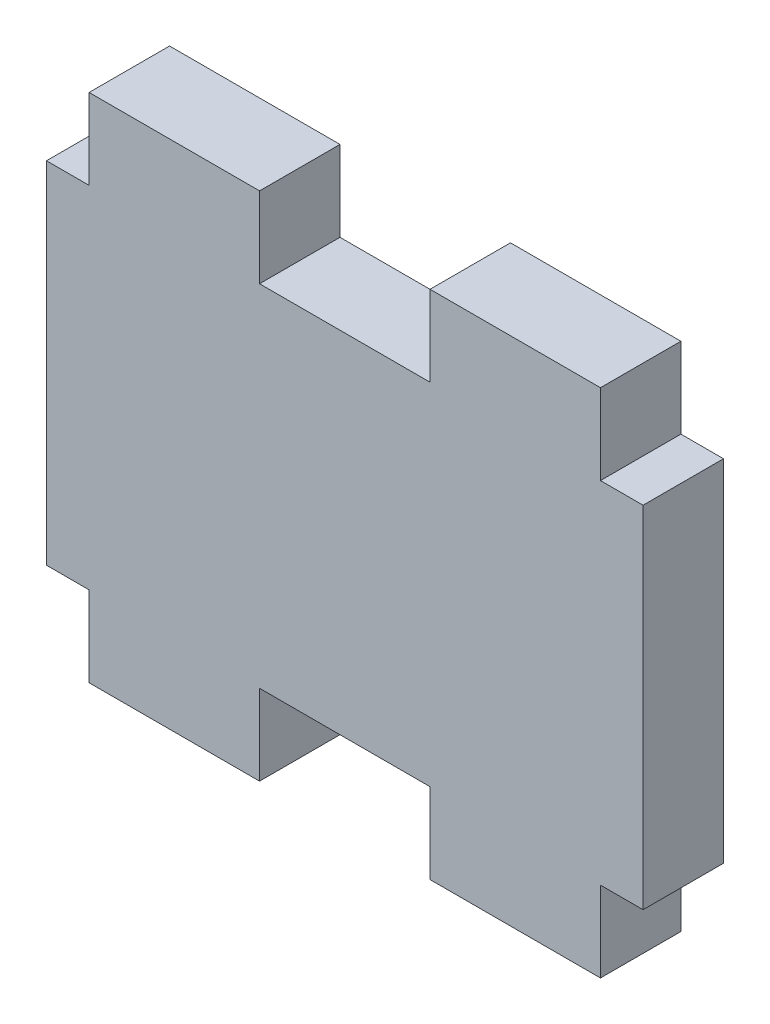
ISO-10303-21;
HEADER;
FILE_DESCRIPTION(('STEP AP214'),'2;1');
FILE_NAME('part.step','',(''),(''),'','','');
FILE_SCHEMA(('AUTOMOTIVE_DESIGN { 1 0 10303 214 1 1 1 1 }'));
ENDSEC;
DATA;
#1=APPLICATION_CONTEXT('core data for automotive mechanical design processes');
#2=APPLICATION_PROTOCOL_DEFINITION('international standard','automotive_design',2000,#1);
#3=PRODUCT_CONTEXT('',#1,'mechanical');
#4=PRODUCT('Part','Part','',(#3));
#5=PRODUCT_RELATED_PRODUCT_CATEGORY('part','',(#4));
#6=PRODUCT_DEFINITION_FORMATION('','',#4);
#7=PRODUCT_DEFINITION_CONTEXT('part definition',#1,'design');
#8=PRODUCT_DEFINITION('design','',#6,#7);
#9=PRODUCT_DEFINITION_SHAPE('','',#8);
#10=(LENGTH_UNIT() NAMED_UNIT(*) SI_UNIT(.MILLI.,.METRE.));
#11=(NAMED_UNIT(*) PLANE_ANGLE_UNIT() SI_UNIT($,.RADIAN.));
#12=(NAMED_UNIT(*) SI_UNIT($,.STERADIAN.) SOLID_ANGLE_UNIT());
#13=UNCERTAINTY_MEASURE_WITH_UNIT(LENGTH_MEASURE(1.E-05),#10,'distance_accuracy_value','');
#14=(GEOMETRIC_REPRESENTATION_CONTEXT(3) GLOBAL_UNCERTAINTY_ASSIGNED_CONTEXT((#13)) GLOBAL_UNIT_ASSIGNED_CONTEXT((#10,
#11,#12)) REPRESENTATION_CONTEXT('',''));
#15=CARTESIAN_POINT('',(0.,0.,0.));
#16=DIRECTION('',(0.,0.,1.));
#17=DIRECTION('',(1.,0.,0.));
#18=AXIS2_PLACEMENT_3D('',#15,#16,#17);
#19=CARTESIAN_POINT('',(0.,0.,2.9972));
#20=DIRECTION('',(1.,0.,0.));
#21=DIRECTION('',(0.,0.,-1.));
#22=AXIS2_PLACEMENT_3D('',#19,#20,#21);
#23=PLANE('',#22);
#24=DIRECTION('',(0.,-1.,0.));
#25=VECTOR('',#24,1.);
#26=CARTESIAN_POINT('',(0.,0.,0.));
#27=LINE('',#26,#25);
#28=CARTESIAN_POINT('',(0.,13.05052,0.));
#29=VERTEX_POINT('',#28);
#30=CARTESIAN_POINT('',(0.,0.,0.));
#31=VERTEX_POINT('',#30);
#32=EDGE_CURVE('E203',#29,#31,#27,.T.);
#33=ORIENTED_EDGE('',*,*,#32,.T.);
#34=DIRECTION('',(0.,0.,-1.));
#35=VECTOR('',#34,1.);
#36=CARTESIAN_POINT('',(0.,0.,2.9972));
#37=LINE('',#36,#35);
#38=CARTESIAN_POINT('',(0.,0.,2.9972));
#39=VERTEX_POINT('',#38);
#40=EDGE_CURVE('E11',#39,#31,#37,.T.);
#41=ORIENTED_EDGE('',*,*,#40,.F.);
#42=DIRECTION('',(0.,-1.,0.));
#43=VECTOR('',#42,1.);
#44=CARTESIAN_POINT('',(0.,0.,2.9972));
#45=LINE('',#44,#43);
#46=CARTESIAN_POINT('',(0.,13.05052,2.9972));
#47=VERTEX_POINT('',#46);
#48=EDGE_CURVE('E241',#47,#39,#45,.T.);
#49=ORIENTED_EDGE('',*,*,#48,.F.);
#50=DIRECTION('',(0.,0.,-1.));
#51=VECTOR('',#50,1.);
#52=CARTESIAN_POINT('',(0.,13.05052,2.9972));
#53=LINE('',#52,#51);
#54=EDGE_CURVE('E199',#47,#29,#53,.T.);
#55=ORIENTED_EDGE('',*,*,#54,.T.);
#56=EDGE_LOOP('',(#33,#41,#49,#55));
#57=FACE_BOUND('',#56,.T.);
#58=ADVANCED_FACE('F35',(#57),#23,.F.);
#59=CARTESIAN_POINT('',(0.,0.,2.9972));
#60=DIRECTION('',(0.,1.,0.));
#61=DIRECTION('',(0.,0.,1.));
#62=AXIS2_PLACEMENT_3D('',#59,#60,#61);
#63=PLANE('',#62);
#64=DIRECTION('',(1.,0.,0.));
#65=VECTOR('',#64,1.);
#66=CARTESIAN_POINT('',(0.,0.,0.));
#67=LINE('',#66,#65);
#68=CARTESIAN_POINT('',(1.5875,0.,0.));
#69=VERTEX_POINT('',#68);
#70=EDGE_CURVE('E206',#31,#69,#67,.T.);
#71=ORIENTED_EDGE('',*,*,#70,.T.);
#72=DIRECTION('',(0.,0.,-1.));
#73=VECTOR('',#72,1.);
#74=CARTESIAN_POINT('',(1.5875,0.,2.9972));
#75=LINE('',#74,#73);
#76=CARTESIAN_POINT('',(1.5875,0.,2.9972));
#77=VERTEX_POINT('',#76);
#78=EDGE_CURVE('E43',#77,#69,#75,.T.);
#79=ORIENTED_EDGE('',*,*,#78,.F.);
#80=DIRECTION('',(1.,0.,0.));
#81=VECTOR('',#80,1.);
#82=CARTESIAN_POINT('',(0.,0.,2.9972));
#83=LINE('',#82,#81);
#84=EDGE_CURVE('E130',#39,#77,#83,.T.);
#85=ORIENTED_EDGE('',*,*,#84,.F.);
#86=ORIENTED_EDGE('',*,*,#40,.T.);
#87=EDGE_LOOP('',(#71,#79,#85,#86));
#88=FACE_BOUND('',#87,.T.);
#89=ADVANCED_FACE('F359',(#88),#63,.F.);
#90=CARTESIAN_POINT('',(1.5875,0.,2.9972));
#91=DIRECTION('',(1.,0.,0.));
#92=DIRECTION('',(0.,1.,0.));
#93=AXIS2_PLACEMENT_3D('',#90,#91,#92);
#94=PLANE('',#93);
#95=DIRECTION('',(0.,-1.,0.));
#96=VECTOR('',#95,1.);
#97=CARTESIAN_POINT('',(1.5875,0.,0.));
#98=LINE('',#97,#96);
#99=CARTESIAN_POINT('',(1.5875,-2.9972,0.));
#100=VERTEX_POINT('',#99);
#101=EDGE_CURVE('E208',#69,#100,#98,.T.);
#102=ORIENTED_EDGE('',*,*,#101,.T.);
#103=DIRECTION('',(0.,0.,-1.));
#104=VECTOR('',#103,1.);
#105=CARTESIAN_POINT('',(1.5875,-2.9972,2.9972));
#106=LINE('',#105,#104);
#107=CARTESIAN_POINT('',(1.5875,-2.9972,2.9972));
#108=VERTEX_POINT('',#107);
#109=EDGE_CURVE('E284',#108,#100,#106,.T.);
#110=ORIENTED_EDGE('',*,*,#109,.F.);
#111=DIRECTION('',(0.,-1.,0.));
#112=VECTOR('',#111,1.);
#113=CARTESIAN_POINT('',(1.5875,0.,2.9972));
#114=LINE('',#113,#112);
#115=EDGE_CURVE('E292',#77,#108,#114,.T.);
#116=ORIENTED_EDGE('',*,*,#115,.F.);
#117=ORIENTED_EDGE('',*,*,#78,.T.);
#118=EDGE_LOOP('',(#102,#110,#116,#117));
#119=FACE_BOUND('',#118,.T.);
#120=ADVANCED_FACE('F290',(#119),#94,.F.);
#121=CARTESIAN_POINT('',(1.5875,-2.9972,2.9972));
#122=DIRECTION('',(0.,1.,0.));
#123=DIRECTION('',(-1.,0.,0.));
#124=AXIS2_PLACEMENT_3D('',#121,#122,#123);
#125=PLANE('',#124);
#126=DIRECTION('',(1.,0.,0.));
#127=VECTOR('',#126,1.);
#128=CARTESIAN_POINT('',(1.5875,-2.9972,0.));
#129=LINE('',#128,#127);
#130=CARTESIAN_POINT('',(7.9375,-2.9972,0.));
#131=VERTEX_POINT('',#130);
#132=EDGE_CURVE('E210',#100,#131,#129,.T.);
#133=ORIENTED_EDGE('',*,*,#132,.T.);
#134=DIRECTION('',(0.,0.,-1.));
#135=VECTOR('',#134,1.);
#136=CARTESIAN_POINT('',(7.9375,-2.9972,2.9972));
#137=LINE('',#136,#135);
#138=CARTESIAN_POINT('',(7.9375,-2.9972,2.9972));
#139=VERTEX_POINT('',#138);
#140=EDGE_CURVE('E281',#139,#131,#137,.T.);
#141=ORIENTED_EDGE('',*,*,#140,.F.);
#142=DIRECTION('',(1.,0.,0.));
#143=VECTOR('',#142,1.);
#144=CARTESIAN_POINT('',(1.5875,-2.9972,2.9972));
#145=LINE('',#144,#143);
#146=EDGE_CURVE('E310',#108,#139,#145,.T.);
#147=ORIENTED_EDGE('',*,*,#146,.F.);
#148=ORIENTED_EDGE('',*,*,#109,.T.);
#149=EDGE_LOOP('',(#133,#141,#147,#148));
#150=FACE_BOUND('',#149,.T.);
#151=ADVANCED_FACE('F301',(#150),#125,.F.);
#152=CARTESIAN_POINT('',(7.9375,-2.9972,2.9972));
#153=DIRECTION('',(-1.,0.,0.));
#154=DIRECTION('',(0.,0.,1.));
#155=AXIS2_PLACEMENT_3D('',#152,#153,#154);
#156=PLANE('',#155);
#157=DIRECTION('',(0.,1.,0.));
#158=VECTOR('',#157,1.);
#159=CARTESIAN_POINT('',(7.9375,-2.9972,0.));
#160=LINE('',#159,#158);
#161=CARTESIAN_POINT('',(7.9375,0.,0.));
#162=VERTEX_POINT('',#161);
#163=EDGE_CURVE('E212',#131,#162,#160,.T.);
#164=ORIENTED_EDGE('',*,*,#163,.T.);
#165=DIRECTION('',(0.,0.,-1.));
#166=VECTOR('',#165,1.);
#167=CARTESIAN_POINT('',(7.9375,0.,2.9972));
#168=LINE('',#167,#166);
#169=CARTESIAN_POINT('',(7.9375,0.,2.9972));
#170=VERTEX_POINT('',#169);
#171=EDGE_CURVE('E278',#170,#162,#168,.T.);
#172=ORIENTED_EDGE('',*,*,#171,.F.);
#173=DIRECTION('',(0.,1.,0.));
#174=VECTOR('',#173,1.);
#175=CARTESIAN_POINT('',(7.9375,-2.9972,2.9972));
#176=LINE('',#175,#174);
#177=EDGE_CURVE('E307',#139,#170,#176,.T.);
#178=ORIENTED_EDGE('',*,*,#177,.F.);
#179=ORIENTED_EDGE('',*,*,#140,.T.);
#180=EDGE_LOOP('',(#164,#172,#178,#179));
#181=FACE_BOUND('',#180,.T.);
#182=ADVANCED_FACE('F305',(#181),#156,.F.);
#183=CARTESIAN_POINT('',(7.9375,0.,2.9972));
#184=DIRECTION('',(0.,1.,0.));
#185=DIRECTION('',(0.,0.,1.));
#186=AXIS2_PLACEMENT_3D('',#183,#184,#185);
#187=PLANE('',#186);
#188=DIRECTION('',(1.,0.,0.));
#189=VECTOR('',#188,1.);
#190=CARTESIAN_POINT('',(7.9375,0.,0.));
#191=LINE('',#190,#189);
#192=CARTESIAN_POINT('',(14.2875,0.,0.));
#193=VERTEX_POINT('',#192);
#194=EDGE_CURVE('E214',#162,#193,#191,.T.);
#195=ORIENTED_EDGE('',*,*,#194,.T.);
#196=DIRECTION('',(0.,0.,-1.));
#197=VECTOR('',#196,1.);
#198=CARTESIAN_POINT('',(14.2875,0.,2.9972));
#199=LINE('',#198,#197);
#200=CARTESIAN_POINT('',(14.2875,0.,2.9972));
#201=VERTEX_POINT('',#200);
#202=EDGE_CURVE('E275',#201,#193,#199,.T.);
#203=ORIENTED_EDGE('',*,*,#202,.F.);
#204=DIRECTION('',(1.,0.,0.));
#205=VECTOR('',#204,1.);
#206=CARTESIAN_POINT('',(7.9375,0.,2.9972));
#207=LINE('',#206,#205);
#208=EDGE_CURVE('E309',#170,#201,#207,.T.);
#209=ORIENTED_EDGE('',*,*,#208,.F.);
#210=ORIENTED_EDGE('',*,*,#171,.T.);
#211=EDGE_LOOP('',(#195,#203,#209,#210));
#212=FACE_BOUND('',#211,.T.);
#213=ADVANCED_FACE('F372',(#212),#187,.F.);
#214=CARTESIAN_POINT('',(14.2875,0.,2.9972));
#215=DIRECTION('',(1.,0.,0.));
#216=DIRECTION('',(0.,0.,-1.));
#217=AXIS2_PLACEMENT_3D('',#214,#215,#216);
#218=PLANE('',#217);
#219=DIRECTION('',(0.,-1.,0.));
#220=VECTOR('',#219,1.);
#221=CARTESIAN_POINT('',(14.2875,0.,0.));
#222=LINE('',#221,#220);
#223=CARTESIAN_POINT('',(14.2875,-2.9972,0.));
#224=VERTEX_POINT('',#223);
#225=EDGE_CURVE('E216',#193,#224,#222,.T.);
#226=ORIENTED_EDGE('',*,*,#225,.T.);
#227=DIRECTION('',(0.,0.,-1.));
#228=VECTOR('',#227,1.);
#229=CARTESIAN_POINT('',(14.2875,-2.9972,2.9972));
#230=LINE('',#229,#228);
#231=CARTESIAN_POINT('',(14.2875,-2.9972,2.9972));
#232=VERTEX_POINT('',#231);
#233=EDGE_CURVE('E272',#232,#224,#230,.T.);
#234=ORIENTED_EDGE('',*,*,#233,.F.);
#235=DIRECTION('',(0.,-1.,0.));
#236=VECTOR('',#235,1.);
#237=CARTESIAN_POINT('',(14.2875,0.,2.9972));
#238=LINE('',#237,#236);
#239=EDGE_CURVE('E312',#201,#232,#238,.T.);
#240=ORIENTED_EDGE('',*,*,#239,.F.);
#241=ORIENTED_EDGE('',*,*,#202,.T.);
#242=EDGE_LOOP('',(#226,#234,#240,#241));
#243=FACE_BOUND('',#242,.T.);
#244=ADVANCED_FACE('F375',(#243),#218,.F.);
#245=CARTESIAN_POINT('',(14.2875,-2.9972,2.9972));
#246=DIRECTION('',(0.,1.,0.));
#247=DIRECTION('',(-1.,0.,0.));
#248=AXIS2_PLACEMENT_3D('',#245,#246,#247);
#249=PLANE('',#248);
#250=DIRECTION('',(1.,0.,0.));
#251=VECTOR('',#250,1.);
#252=CARTESIAN_POINT('',(14.2875,-2.9972,0.));
#253=LINE('',#252,#251);
#254=CARTESIAN_POINT('',(20.6375,-2.9972,0.));
#255=VERTEX_POINT('',#254);
#256=EDGE_CURVE('E218',#224,#255,#253,.T.);
#257=ORIENTED_EDGE('',*,*,#256,.T.);
#258=DIRECTION('',(0.,0.,-1.));
#259=VECTOR('',#258,1.);
#260=CARTESIAN_POINT('',(20.6375,-2.9972,2.9972));
#261=LINE('',#260,#259);
#262=CARTESIAN_POINT('',(20.6375,-2.9972,2.9972));
#263=VERTEX_POINT('',#262);
#264=EDGE_CURVE('E269',#263,#255,#261,.T.);
#265=ORIENTED_EDGE('',*,*,#264,.F.);
#266=DIRECTION('',(1.,0.,0.));
#267=VECTOR('',#266,1.);
#268=CARTESIAN_POINT('',(14.2875,-2.9972,2.9972));
#269=LINE('',#268,#267);
#270=EDGE_CURVE('E318',#232,#263,#269,.T.);
#271=ORIENTED_EDGE('',*,*,#270,.F.);
#272=ORIENTED_EDGE('',*,*,#233,.T.);
#273=EDGE_LOOP('',(#257,#265,#271,#272));
#274=FACE_BOUND('',#273,.T.);
#275=ADVANCED_FACE('F379',(#274),#249,.F.);
#276=CARTESIAN_POINT('',(20.6375,-2.9972,2.9972));
#277=DIRECTION('',(-1.,0.,0.));
#278=DIRECTION('',(0.,0.,1.));
#279=AXIS2_PLACEMENT_3D('',#276,#277,#278);
#280=PLANE('',#279);
#281=DIRECTION('',(0.,1.,0.));
#282=VECTOR('',#281,1.);
#283=CARTESIAN_POINT('',(20.6375,-2.9972,0.));
#284=LINE('',#283,#282);
#285=CARTESIAN_POINT('',(20.6375,0.,0.));
#286=VERTEX_POINT('',#285);
#287=EDGE_CURVE('E220',#255,#286,#284,.T.);
#288=ORIENTED_EDGE('',*,*,#287,.T.);
#289=DIRECTION('',(0.,0.,-1.));
#290=VECTOR('',#289,1.);
#291=CARTESIAN_POINT('',(20.6375,0.,2.9972));
#292=LINE('',#291,#290);
#293=CARTESIAN_POINT('',(20.6375,0.,2.9972));
#294=VERTEX_POINT('',#293);
#295=EDGE_CURVE('E266',#294,#286,#292,.T.);
#296=ORIENTED_EDGE('',*,*,#295,.F.);
#297=DIRECTION('',(0.,1.,0.));
#298=VECTOR('',#297,1.);
#299=CARTESIAN_POINT('',(20.6375,-2.9972,2.9972));
#300=LINE('',#299,#298);
#301=EDGE_CURVE('E320',#263,#294,#300,.T.);
#302=ORIENTED_EDGE('',*,*,#301,.F.);
#303=ORIENTED_EDGE('',*,*,#264,.T.);
#304=EDGE_LOOP('',(#288,#296,#302,#303));
#305=FACE_BOUND('',#304,.T.);
#306=ADVANCED_FACE('F383',(#305),#280,.F.);
#307=CARTESIAN_POINT('',(20.6375,0.,2.9972));
#308=DIRECTION('',(0.,1.,0.));
#309=DIRECTION('',(0.,0.,1.));
#310=AXIS2_PLACEMENT_3D('',#307,#308,#309);
#311=PLANE('',#310);
#312=DIRECTION('',(1.,0.,0.));
#313=VECTOR('',#312,1.);
#314=CARTESIAN_POINT('',(20.6375,0.,0.));
#315=LINE('',#314,#313);
#316=CARTESIAN_POINT('',(22.225,0.,0.));
#317=VERTEX_POINT('',#316);
#318=EDGE_CURVE('E222',#286,#317,#315,.T.);
#319=ORIENTED_EDGE('',*,*,#318,.T.);
#320=DIRECTION('',(0.,0.,-1.));
#321=VECTOR('',#320,1.);
#322=CARTESIAN_POINT('',(22.225,0.,2.9972));
#323=LINE('',#322,#321);
#324=CARTESIAN_POINT('',(22.225,0.,2.9972));
#325=VERTEX_POINT('',#324);
#326=EDGE_CURVE('E263',#325,#317,#323,.T.);
#327=ORIENTED_EDGE('',*,*,#326,.F.);
#328=DIRECTION('',(1.,0.,0.));
#329=VECTOR('',#328,1.);
#330=CARTESIAN_POINT('',(20.6375,0.,2.9972));
#331=LINE('',#330,#329);
#332=EDGE_CURVE('E322',#294,#325,#331,.T.);
#333=ORIENTED_EDGE('',*,*,#332,.F.);
#334=ORIENTED_EDGE('',*,*,#295,.T.);
#335=EDGE_LOOP('',(#319,#327,#333,#334));
#336=FACE_BOUND('',#335,.T.);
#337=ADVANCED_FACE('F387',(#336),#311,.F.);
#338=CARTESIAN_POINT('',(22.225,0.,2.9972));
#339=DIRECTION('',(-1.,0.,0.));
#340=DIRECTION('',(0.,0.,1.));
#341=AXIS2_PLACEMENT_3D('',#338,#339,#340);
#342=PLANE('',#341);
#343=DIRECTION('',(0.,1.,0.));
#344=VECTOR('',#343,1.);
#345=CARTESIAN_POINT('',(22.225,0.,0.));
#346=LINE('',#345,#344);
#347=CARTESIAN_POINT('',(22.225,13.05052,0.));
#348=VERTEX_POINT('',#347);
#349=EDGE_CURVE('E224',#317,#348,#346,.T.);
#350=ORIENTED_EDGE('',*,*,#349,.T.);
#351=DIRECTION('',(0.,0.,-1.));
#352=VECTOR('',#351,1.);
#353=CARTESIAN_POINT('',(22.225,13.05052,2.9972));
#354=LINE('',#353,#352);
#355=CARTESIAN_POINT('',(22.225,13.05052,2.9972));
#356=VERTEX_POINT('',#355);
#357=EDGE_CURVE('E260',#356,#348,#354,.T.);
#358=ORIENTED_EDGE('',*,*,#357,.F.);
#359=DIRECTION('',(0.,1.,0.));
#360=VECTOR('',#359,1.);
#361=CARTESIAN_POINT('',(22.225,0.,2.9972));
#362=LINE('',#361,#360);
#363=EDGE_CURVE('E324',#325,#356,#362,.T.);
#364=ORIENTED_EDGE('',*,*,#363,.F.);
#365=ORIENTED_EDGE('',*,*,#326,.T.);
#366=EDGE_LOOP('',(#350,#358,#364,#365));
#367=FACE_BOUND('',#366,.T.);
#368=ADVANCED_FACE('F391',(#367),#342,.F.);
#369=CARTESIAN_POINT('',(20.6375,13.05052,2.9972));
#370=DIRECTION('',(0.,-1.,0.));
#371=DIRECTION('',(0.,0.,-1.));
#372=AXIS2_PLACEMENT_3D('',#369,#370,#371);
#373=PLANE('',#372);
#374=DIRECTION('',(-1.,0.,0.));
#375=VECTOR('',#374,1.);
#376=CARTESIAN_POINT('',(20.6375,13.05052,0.));
#377=LINE('',#376,#375);
#378=CARTESIAN_POINT('',(20.6375,13.05052,0.));
#379=VERTEX_POINT('',#378);
#380=EDGE_CURVE('E226',#348,#379,#377,.T.);
#381=ORIENTED_EDGE('',*,*,#380,.T.);
#382=DIRECTION('',(0.,0.,-1.));
#383=VECTOR('',#382,1.);
#384=CARTESIAN_POINT('',(20.6375,13.05052,2.9972));
#385=LINE('',#384,#383);
#386=CARTESIAN_POINT('',(20.6375,13.05052,2.9972));
#387=VERTEX_POINT('',#386);
#388=EDGE_CURVE('E257',#387,#379,#385,.T.);
#389=ORIENTED_EDGE('',*,*,#388,.F.);
#390=DIRECTION('',(-1.,0.,0.));
#391=VECTOR('',#390,1.);
#392=CARTESIAN_POINT('',(20.6375,13.05052,2.9972));
#393=LINE('',#392,#391);
#394=EDGE_CURVE('E326',#356,#387,#393,.T.);
#395=ORIENTED_EDGE('',*,*,#394,.F.);
#396=ORIENTED_EDGE('',*,*,#357,.T.);
#397=EDGE_LOOP('',(#381,#389,#395,#396));
#398=FACE_BOUND('',#397,.T.);
#399=ADVANCED_FACE('F395',(#398),#373,.F.);
#400=CARTESIAN_POINT('',(20.6375,16.04772,2.9972));
#401=DIRECTION('',(-1.,0.,0.));
#402=DIRECTION('',(0.,0.,1.));
#403=AXIS2_PLACEMENT_3D('',#400,#401,#402);
#404=PLANE('',#403);
#405=DIRECTION('',(0.,1.,0.));
#406=VECTOR('',#405,1.);
#407=CARTESIAN_POINT('',(20.6375,16.04772,0.));
#408=LINE('',#407,#406);
#409=CARTESIAN_POINT('',(20.6375,16.04772,0.));
#410=VERTEX_POINT('',#409);
#411=EDGE_CURVE('E228',#379,#410,#408,.T.);
#412=ORIENTED_EDGE('',*,*,#411,.T.);
#413=DIRECTION('',(0.,0.,-1.));
#414=VECTOR('',#413,1.);
#415=CARTESIAN_POINT('',(20.6375,16.04772,2.9972));
#416=LINE('',#415,#414);
#417=CARTESIAN_POINT('',(20.6375,16.04772,2.9972));
#418=VERTEX_POINT('',#417);
#419=EDGE_CURVE('E254',#418,#410,#416,.T.);
#420=ORIENTED_EDGE('',*,*,#419,.F.);
#421=DIRECTION('',(0.,1.,0.));
#422=VECTOR('',#421,1.);
#423=CARTESIAN_POINT('',(20.6375,16.04772,2.9972));
#424=LINE('',#423,#422);
#425=EDGE_CURVE('E328',#387,#418,#424,.T.);
#426=ORIENTED_EDGE('',*,*,#425,.F.);
#427=ORIENTED_EDGE('',*,*,#388,.T.);
#428=EDGE_LOOP('',(#412,#420,#426,#427));
#429=FACE_BOUND('',#428,.T.);
#430=ADVANCED_FACE('F399',(#429),#404,.F.);
#431=CARTESIAN_POINT('',(14.2875,16.04772,2.9972));
#432=DIRECTION('',(0.,-1.,0.));
#433=DIRECTION('',(0.,0.,-1.));
#434=AXIS2_PLACEMENT_3D('',#431,#432,#433);
#435=PLANE('',#434);
#436=DIRECTION('',(-1.,0.,0.));
#437=VECTOR('',#436,1.);
#438=CARTESIAN_POINT('',(14.2875,16.04772,0.));
#439=LINE('',#438,#437);
#440=CARTESIAN_POINT('',(14.2875,16.04772,0.));
#441=VERTEX_POINT('',#440);
#442=EDGE_CURVE('E230',#410,#441,#439,.T.);
#443=ORIENTED_EDGE('',*,*,#442,.T.);
#444=DIRECTION('',(0.,0.,-1.));
#445=VECTOR('',#444,1.);
#446=CARTESIAN_POINT('',(14.2875,16.04772,2.9972));
#447=LINE('',#446,#445);
#448=CARTESIAN_POINT('',(14.2875,16.04772,2.9972));
#449=VERTEX_POINT('',#448);
#450=EDGE_CURVE('E251',#449,#441,#447,.T.);
#451=ORIENTED_EDGE('',*,*,#450,.F.);
#452=DIRECTION('',(-1.,0.,0.));
#453=VECTOR('',#452,1.);
#454=CARTESIAN_POINT('',(14.2875,16.04772,2.9972));
#455=LINE('',#454,#453);
#456=EDGE_CURVE('E330',#418,#449,#455,.T.);
#457=ORIENTED_EDGE('',*,*,#456,.F.);
#458=ORIENTED_EDGE('',*,*,#419,.T.);
#459=EDGE_LOOP('',(#443,#451,#457,#458));
#460=FACE_BOUND('',#459,.T.);
#461=ADVANCED_FACE('F403',(#460),#435,.F.);
#462=CARTESIAN_POINT('',(14.2875,13.05052,2.9972));
#463=DIRECTION('',(1.,0.,0.));
#464=DIRECTION('',(0.,0.,-1.));
#465=AXIS2_PLACEMENT_3D('',#462,#463,#464);
#466=PLANE('',#465);
#467=DIRECTION('',(0.,-1.,0.));
#468=VECTOR('',#467,1.);
#469=CARTESIAN_POINT('',(14.2875,13.05052,0.));
#470=LINE('',#469,#468);
#471=CARTESIAN_POINT('',(14.2875,13.05052,0.));
#472=VERTEX_POINT('',#471);
#473=EDGE_CURVE('E232',#441,#472,#470,.T.);
#474=ORIENTED_EDGE('',*,*,#473,.T.);
#475=DIRECTION('',(0.,0.,-1.));
#476=VECTOR('',#475,1.);
#477=CARTESIAN_POINT('',(14.2875,13.05052,2.9972));
#478=LINE('',#477,#476);
#479=CARTESIAN_POINT('',(14.2875,13.05052,2.9972));
#480=VERTEX_POINT('',#479);
#481=EDGE_CURVE('E248',#480,#472,#478,.T.);
#482=ORIENTED_EDGE('',*,*,#481,.F.);
#483=DIRECTION('',(0.,-1.,0.));
#484=VECTOR('',#483,1.);
#485=CARTESIAN_POINT('',(14.2875,13.05052,2.9972));
#486=LINE('',#485,#484);
#487=EDGE_CURVE('E332',#449,#480,#486,.T.);
#488=ORIENTED_EDGE('',*,*,#487,.F.);
#489=ORIENTED_EDGE('',*,*,#450,.T.);
#490=EDGE_LOOP('',(#474,#482,#488,#489));
#491=FACE_BOUND('',#490,.T.);
#492=ADVANCED_FACE('F407',(#491),#466,.F.);
#493=CARTESIAN_POINT('',(7.9375,13.05052,2.9972));
#494=DIRECTION('',(0.,-1.,0.));
#495=DIRECTION('',(0.,0.,-1.));
#496=AXIS2_PLACEMENT_3D('',#493,#494,#495);
#497=PLANE('',#496);
#498=DIRECTION('',(-1.,0.,0.));
#499=VECTOR('',#498,1.);
#500=CARTESIAN_POINT('',(7.9375,13.05052,0.));
#501=LINE('',#500,#499);
#502=CARTESIAN_POINT('',(7.9375,13.05052,0.));
#503=VERTEX_POINT('',#502);
#504=EDGE_CURVE('E234',#472,#503,#501,.T.);
#505=ORIENTED_EDGE('',*,*,#504,.T.);
#506=DIRECTION('',(0.,0.,-1.));
#507=VECTOR('',#506,1.);
#508=CARTESIAN_POINT('',(7.9375,13.05052,2.9972));
#509=LINE('',#508,#507);
#510=CARTESIAN_POINT('',(7.9375,13.05052,2.9972));
#511=VERTEX_POINT('',#510);
#512=EDGE_CURVE('E245',#511,#503,#509,.T.);
#513=ORIENTED_EDGE('',*,*,#512,.F.);
#514=DIRECTION('',(-1.,0.,0.));
#515=VECTOR('',#514,1.);
#516=CARTESIAN_POINT('',(7.9375,13.05052,2.9972));
#517=LINE('',#516,#515);
#518=EDGE_CURVE('E334',#480,#511,#517,.T.);
#519=ORIENTED_EDGE('',*,*,#518,.F.);
#520=ORIENTED_EDGE('',*,*,#481,.T.);
#521=EDGE_LOOP('',(#505,#513,#519,#520));
#522=FACE_BOUND('',#521,.T.);
#523=ADVANCED_FACE('F340',(#522),#497,.F.);
#524=CARTESIAN_POINT('',(7.9375,16.04772,2.9972));
#525=DIRECTION('',(-1.,0.,0.));
#526=DIRECTION('',(0.,0.,1.));
#527=AXIS2_PLACEMENT_3D('',#524,#525,#526);
#528=PLANE('',#527);
#529=DIRECTION('',(0.,1.,0.));
#530=VECTOR('',#529,1.);
#531=CARTESIAN_POINT('',(7.9375,16.04772,0.));
#532=LINE('',#531,#530);
#533=CARTESIAN_POINT('',(7.9375,16.04772,0.));
#534=VERTEX_POINT('',#533);
#535=EDGE_CURVE('E236',#503,#534,#532,.T.);
#536=ORIENTED_EDGE('',*,*,#535,.T.);
#537=DIRECTION('',(0.,0.,-1.));
#538=VECTOR('',#537,1.);
#539=CARTESIAN_POINT('',(7.9375,16.04772,2.9972));
#540=LINE('',#539,#538);
#541=CARTESIAN_POINT('',(7.9375,16.04772,2.9972));
#542=VERTEX_POINT('',#541);
#543=EDGE_CURVE('E194',#542,#534,#540,.T.);
#544=ORIENTED_EDGE('',*,*,#543,.F.);
#545=DIRECTION('',(0.,1.,0.));
#546=VECTOR('',#545,1.);
#547=CARTESIAN_POINT('',(7.9375,16.04772,2.9972));
#548=LINE('',#547,#546);
#549=EDGE_CURVE('E185',#511,#542,#548,.T.);
#550=ORIENTED_EDGE('',*,*,#549,.F.);
#551=ORIENTED_EDGE('',*,*,#512,.T.);
#552=EDGE_LOOP('',(#536,#544,#550,#551));
#553=FACE_BOUND('',#552,.T.);
#554=ADVANCED_FACE('F344',(#553),#528,.F.);
#555=CARTESIAN_POINT('',(1.5875,16.04772,2.9972));
#556=DIRECTION('',(0.,-1.,0.));
#557=DIRECTION('',(0.,0.,-1.));
#558=AXIS2_PLACEMENT_3D('',#555,#556,#557);
#559=PLANE('',#558);
#560=DIRECTION('',(-1.,0.,0.));
#561=VECTOR('',#560,1.);
#562=CARTESIAN_POINT('',(1.5875,16.04772,0.));
#563=LINE('',#562,#561);
#564=CARTESIAN_POINT('',(1.5875,16.04772,0.));
#565=VERTEX_POINT('',#564);
#566=EDGE_CURVE('E193',#534,#565,#563,.T.);
#567=ORIENTED_EDGE('',*,*,#566,.T.);
#568=DIRECTION('',(0.,0.,-1.));
#569=VECTOR('',#568,1.);
#570=CARTESIAN_POINT('',(1.5875,16.04772,2.9972));
#571=LINE('',#570,#569);
#572=CARTESIAN_POINT('',(1.5875,16.04772,2.9972));
#573=VERTEX_POINT('',#572);
#574=EDGE_CURVE('E190',#573,#565,#571,.T.);
#575=ORIENTED_EDGE('',*,*,#574,.F.);
#576=DIRECTION('',(-1.,0.,0.));
#577=VECTOR('',#576,1.);
#578=CARTESIAN_POINT('',(1.5875,16.04772,2.9972));
#579=LINE('',#578,#577);
#580=EDGE_CURVE('E179',#542,#573,#579,.T.);
#581=ORIENTED_EDGE('',*,*,#580,.F.);
#582=ORIENTED_EDGE('',*,*,#543,.T.);
#583=EDGE_LOOP('',(#567,#575,#581,#582));
#584=FACE_BOUND('',#583,.T.);
#585=ADVANCED_FACE('F191',(#584),#559,.F.);
#586=CARTESIAN_POINT('',(1.5875,13.05052,2.9972));
#587=DIRECTION('',(1.,0.,0.));
#588=DIRECTION('',(0.,1.,0.));
#589=AXIS2_PLACEMENT_3D('',#586,#587,#588);
#590=PLANE('',#589);
#591=DIRECTION('',(0.,-1.,0.));
#592=VECTOR('',#591,1.);
#593=CARTESIAN_POINT('',(1.5875,13.05052,0.));
#594=LINE('',#593,#592);
#595=CARTESIAN_POINT('',(1.5875,13.05052,0.));
#596=VERTEX_POINT('',#595);
#597=EDGE_CURVE('E116',#565,#596,#594,.T.);
#598=ORIENTED_EDGE('',*,*,#597,.T.);
#599=DIRECTION('',(0.,0.,-1.));
#600=VECTOR('',#599,1.);
#601=CARTESIAN_POINT('',(1.5875,13.05052,2.9972));
#602=LINE('',#601,#600);
#603=CARTESIAN_POINT('',(1.5875,13.05052,2.9972));
#604=VERTEX_POINT('',#603);
#605=EDGE_CURVE('E195',#604,#596,#602,.T.);
#606=ORIENTED_EDGE('',*,*,#605,.F.);
#607=DIRECTION('',(0.,-1.,0.));
#608=VECTOR('',#607,1.);
#609=CARTESIAN_POINT('',(1.5875,13.05052,2.9972));
#610=LINE('',#609,#608);
#611=EDGE_CURVE('E183',#573,#604,#610,.T.);
#612=ORIENTED_EDGE('',*,*,#611,.F.);
#613=ORIENTED_EDGE('',*,*,#574,.T.);
#614=EDGE_LOOP('',(#598,#606,#612,#613));
#615=FACE_BOUND('',#614,.T.);
#616=ADVANCED_FACE('F197',(#615),#590,.F.);
#617=CARTESIAN_POINT('',(0.,13.05052,2.9972));
#618=DIRECTION('',(0.,-1.,0.));
#619=DIRECTION('',(0.,0.,-1.));
#620=AXIS2_PLACEMENT_3D('',#617,#618,#619);
#621=PLANE('',#620);
#622=DIRECTION('',(-1.,0.,0.));
#623=VECTOR('',#622,1.);
#624=CARTESIAN_POINT('',(0.,13.05052,0.));
#625=LINE('',#624,#623);
#626=EDGE_CURVE('E122',#596,#29,#625,.T.);
#627=ORIENTED_EDGE('',*,*,#626,.T.);
#628=ORIENTED_EDGE('',*,*,#54,.F.);
#629=DIRECTION('',(-1.,0.,0.));
#630=VECTOR('',#629,1.);
#631=CARTESIAN_POINT('',(0.,13.05052,2.9972));
#632=LINE('',#631,#630);
#633=EDGE_CURVE('E51',#604,#47,#632,.T.);
#634=ORIENTED_EDGE('',*,*,#633,.F.);
#635=ORIENTED_EDGE('',*,*,#605,.T.);
#636=EDGE_LOOP('',(#627,#628,#634,#635));
#637=FACE_BOUND('',#636,.T.);
#638=ADVANCED_FACE('F348',(#637),#621,.F.);
#639=CARTESIAN_POINT('',(0.,13.05052,2.9972));
#640=DIRECTION('',(0.,0.,-1.));
#641=DIRECTION('',(-1.,0.,0.));
#642=AXIS2_PLACEMENT_3D('',#639,#640,#641);
#643=PLANE('',#642);
#644=ORIENTED_EDGE('',*,*,#48,.T.);
#645=ORIENTED_EDGE('',*,*,#84,.T.);
#646=ORIENTED_EDGE('',*,*,#115,.T.);
#647=ORIENTED_EDGE('',*,*,#146,.T.);
#648=ORIENTED_EDGE('',*,*,#177,.T.);
#649=ORIENTED_EDGE('',*,*,#208,.T.);
#650=ORIENTED_EDGE('',*,*,#239,.T.);
#651=ORIENTED_EDGE('',*,*,#270,.T.);
#652=ORIENTED_EDGE('',*,*,#301,.T.);
#653=ORIENTED_EDGE('',*,*,#332,.T.);
#654=ORIENTED_EDGE('',*,*,#363,.T.);
#655=ORIENTED_EDGE('',*,*,#394,.T.);
#656=ORIENTED_EDGE('',*,*,#425,.T.);
#657=ORIENTED_EDGE('',*,*,#456,.T.);
#658=ORIENTED_EDGE('',*,*,#487,.T.);
#659=ORIENTED_EDGE('',*,*,#518,.T.);
#660=ORIENTED_EDGE('',*,*,#549,.T.);
#661=ORIENTED_EDGE('',*,*,#580,.T.);
#662=ORIENTED_EDGE('',*,*,#611,.T.);
#663=ORIENTED_EDGE('',*,*,#633,.T.);
#664=EDGE_LOOP('',(#644,#645,#646,#647,#648,#649,#650,#651,#652,#653,#654,#655,#656,#657,#658,
#659,#660,#661,#662,#663));
#665=FACE_BOUND('',#664,.T.);
#666=ADVANCED_FACE('F181',(#665),#643,.F.);
#667=CARTESIAN_POINT('',(0.,13.05052,0.));
#668=DIRECTION('',(0.,0.,-1.));
#669=DIRECTION('',(-1.,0.,0.));
#670=AXIS2_PLACEMENT_3D('',#667,#668,#669);
#671=PLANE('',#670);
#672=ORIENTED_EDGE('',*,*,#32,.F.);
#673=ORIENTED_EDGE('',*,*,#626,.F.);
#674=ORIENTED_EDGE('',*,*,#597,.F.);
#675=ORIENTED_EDGE('',*,*,#566,.F.);
#676=ORIENTED_EDGE('',*,*,#535,.F.);
#677=ORIENTED_EDGE('',*,*,#504,.F.);
#678=ORIENTED_EDGE('',*,*,#473,.F.);
#679=ORIENTED_EDGE('',*,*,#442,.F.);
#680=ORIENTED_EDGE('',*,*,#411,.F.);
#681=ORIENTED_EDGE('',*,*,#380,.F.);
#682=ORIENTED_EDGE('',*,*,#349,.F.);
#683=ORIENTED_EDGE('',*,*,#318,.F.);
#684=ORIENTED_EDGE('',*,*,#287,.F.);
#685=ORIENTED_EDGE('',*,*,#256,.F.);
#686=ORIENTED_EDGE('',*,*,#225,.F.);
#687=ORIENTED_EDGE('',*,*,#194,.F.);
#688=ORIENTED_EDGE('',*,*,#163,.F.);
#689=ORIENTED_EDGE('',*,*,#132,.F.);
#690=ORIENTED_EDGE('',*,*,#101,.F.);
#691=ORIENTED_EDGE('',*,*,#70,.F.);
#692=EDGE_LOOP('',(#672,#673,#674,#675,#676,#677,#678,#679,#680,#681,#682,#683,#684,#685,#686,
#687,#688,#689,#690,#691));
#693=FACE_BOUND('',#692,.T.);
#694=ADVANCED_FACE('F296',(#693),#671,.T.);
#695=CLOSED_SHELL('',(#58,#89,#120,#151,#182,#213,#244,#275,#306,#337,#368,#399,#430,#461,#492,
#523,#554,#585,#616,#638,#666,#694));
#696=MANIFOLD_SOLID_BREP('B2',#695);
#697=ADVANCED_BREP_SHAPE_REPRESENTATION('',(#18,#696),#14);
#698=SHAPE_DEFINITION_REPRESENTATION(#9,#697);
ENDSEC;
END-ISO-10303-21;
